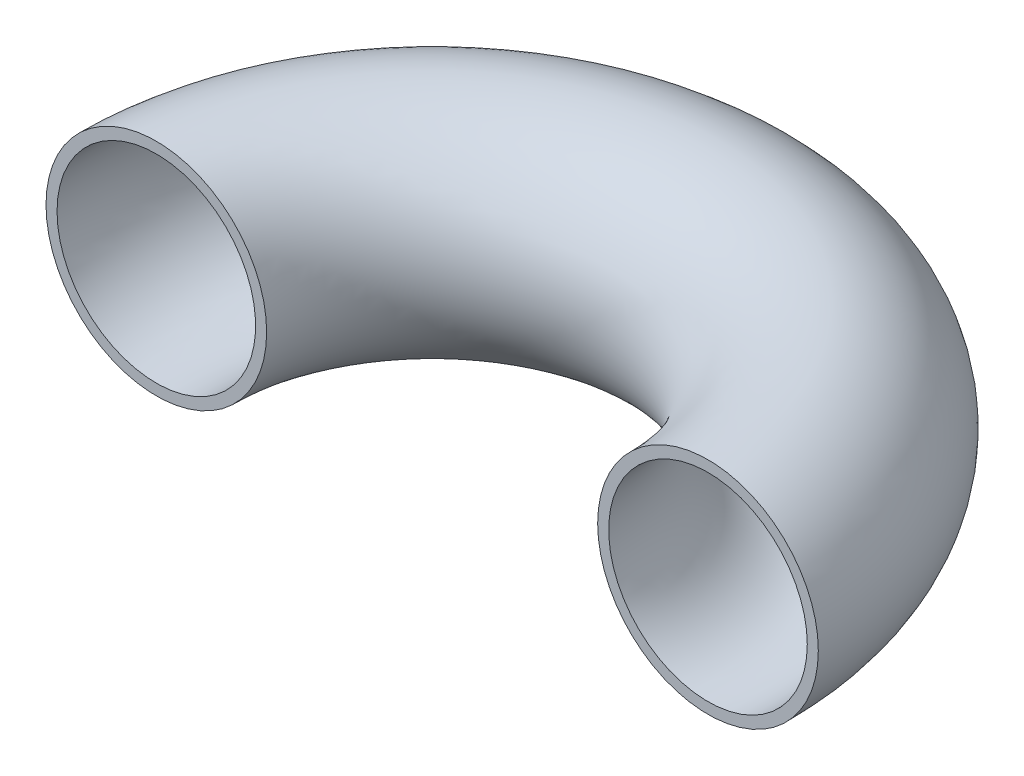
ISO-10303-21;
HEADER;
FILE_DESCRIPTION(('STEP AP214'),'2;1');
FILE_NAME('part.step','',(''),(''),'','','');
FILE_SCHEMA(('AUTOMOTIVE_DESIGN { 1 0 10303 214 1 1 1 1 }'));
ENDSEC;
DATA;
#1=APPLICATION_CONTEXT('core data for automotive mechanical design processes');
#2=APPLICATION_PROTOCOL_DEFINITION('international standard','automotive_design',2000,#1);
#3=PRODUCT_CONTEXT('',#1,'mechanical');
#4=PRODUCT('Part','Part','',(#3));
#5=PRODUCT_RELATED_PRODUCT_CATEGORY('part','',(#4));
#6=PRODUCT_DEFINITION_FORMATION('','',#4);
#7=PRODUCT_DEFINITION_CONTEXT('part definition',#1,'design');
#8=PRODUCT_DEFINITION('design','',#6,#7);
#9=PRODUCT_DEFINITION_SHAPE('','',#8);
#10=(LENGTH_UNIT() NAMED_UNIT(*) SI_UNIT(.MILLI.,.METRE.));
#11=(NAMED_UNIT(*) PLANE_ANGLE_UNIT() SI_UNIT($,.RADIAN.));
#12=(NAMED_UNIT(*) SI_UNIT($,.STERADIAN.) SOLID_ANGLE_UNIT());
#13=UNCERTAINTY_MEASURE_WITH_UNIT(LENGTH_MEASURE(1.E-05),#10,'distance_accuracy_value','');
#14=(GEOMETRIC_REPRESENTATION_CONTEXT(3) GLOBAL_UNCERTAINTY_ASSIGNED_CONTEXT((#13)) GLOBAL_UNIT_ASSIGNED_CONTEXT((#10,
#11,#12)) REPRESENTATION_CONTEXT('',''));
#15=CARTESIAN_POINT('',(0.,0.,0.));
#16=DIRECTION('',(0.,0.,1.));
#17=DIRECTION('',(1.,0.,0.));
#18=AXIS2_PLACEMENT_3D('',#15,#16,#17);
#19=CARTESIAN_POINT('',(0.,0.,0.));
#20=DIRECTION('',(0.,0.,1.));
#21=DIRECTION('',(1.,0.,0.));
#22=AXIS2_PLACEMENT_3D('',#19,#20,#21);
#23=PLANE('',#22);
#24=CARTESIAN_POINT('',(0.,0.,0.));
#25=DIRECTION('',(0.,0.,1.));
#26=DIRECTION('',(1.,0.,0.));
#27=AXIS2_PLACEMENT_3D('',#24,#25,#26);
#28=CIRCLE('',#27,4.5);
#29=CARTESIAN_POINT('',(-4.5,0.,0.));
#30=VERTEX_POINT('',#29);
#31=EDGE_CURVE('E51',#30,#30,#28,.T.);
#32=ORIENTED_EDGE('',*,*,#31,.F.);
#33=EDGE_LOOP('',(#32));
#34=FACE_BOUND('',#33,.T.);
#35=CARTESIAN_POINT('',(0.,0.,0.));
#36=DIRECTION('',(0.,0.,1.));
#37=DIRECTION('',(1.,0.,0.));
#38=AXIS2_PLACEMENT_3D('',#35,#36,#37);
#39=CIRCLE('',#38,5.);
#40=CARTESIAN_POINT('',(-5.,0.,0.));
#41=VERTEX_POINT('',#40);
#42=EDGE_CURVE('E43',#41,#41,#39,.T.);
#43=ORIENTED_EDGE('',*,*,#42,.T.);
#44=EDGE_LOOP('',(#43));
#45=FACE_BOUND('',#44,.T.);
#46=ADVANCED_FACE('F37',(#34,#45),#23,.T.);
#47=CARTESIAN_POINT('',(25.,0.,0.));
#48=DIRECTION('',(0.,0.,-1.));
#49=DIRECTION('',(-1.,0.,0.));
#50=AXIS2_PLACEMENT_3D('',#47,#48,#49);
#51=PLANE('',#50);
#52=CARTESIAN_POINT('',(25.,0.,0.));
#53=DIRECTION('',(0.,0.,-1.));
#54=DIRECTION('',(-1.,0.,0.));
#55=AXIS2_PLACEMENT_3D('',#52,#53,#54);
#56=CIRCLE('',#55,4.5);
#57=CARTESIAN_POINT('',(29.5,0.,0.));
#58=VERTEX_POINT('',#57);
#59=EDGE_CURVE('E47',#58,#58,#56,.T.);
#60=ORIENTED_EDGE('',*,*,#59,.T.);
#61=EDGE_LOOP('',(#60));
#62=FACE_BOUND('',#61,.T.);
#63=CARTESIAN_POINT('',(25.,0.,0.));
#64=DIRECTION('',(0.,0.,-1.));
#65=DIRECTION('',(-1.,0.,0.));
#66=AXIS2_PLACEMENT_3D('',#63,#64,#65);
#67=CIRCLE('',#66,5.);
#68=CARTESIAN_POINT('',(30.,0.,0.));
#69=VERTEX_POINT('',#68);
#70=EDGE_CURVE('E10',#69,#69,#67,.T.);
#71=ORIENTED_EDGE('',*,*,#70,.F.);
#72=EDGE_LOOP('',(#71));
#73=FACE_BOUND('',#72,.T.);
#74=ADVANCED_FACE('F60',(#62,#73),#51,.F.);
#75=CARTESIAN_POINT('',(12.5,0.,0.));
#76=DIRECTION('',(0.,-1.,0.));
#77=DIRECTION('',(0.,0.,-1.));
#78=AXIS2_PLACEMENT_3D('',#75,#76,#77);
#79=TOROIDAL_SURFACE('',#78,12.5,5.);
#80=CARTESIAN_POINT('',(12.5,0.,0.));
#81=DIRECTION('',(0.,-1.,0.));
#82=DIRECTION('',(0.,0.,-1.));
#83=AXIS2_PLACEMENT_3D('',#80,#81,#82);
#84=CIRCLE('',#83,17.5);
#85=EDGE_CURVE('',#41,#69,#84,.T.);
#86=ORIENTED_EDGE('',*,*,#42,.F.);
#87=ORIENTED_EDGE('',*,*,#70,.T.);
#88=ORIENTED_EDGE('',*,*,#85,.T.);
#89=ORIENTED_EDGE('',*,*,#85,.F.);
#90=EDGE_LOOP('',(#86,#88,#87,#89));
#91=FACE_BOUND('',#90,.T.);
#92=ADVANCED_FACE('F65',(#91),#79,.T.);
#93=CARTESIAN_POINT('',(12.5,0.,0.));
#94=DIRECTION('',(0.,-1.,0.));
#95=DIRECTION('',(0.,0.,-1.));
#96=AXIS2_PLACEMENT_3D('',#93,#94,#95);
#97=TOROIDAL_SURFACE('',#96,12.5,4.5);
#98=CARTESIAN_POINT('',(12.5,0.,0.));
#99=DIRECTION('',(0.,-1.,0.));
#100=DIRECTION('',(0.,0.,-1.));
#101=AXIS2_PLACEMENT_3D('',#98,#99,#100);
#102=CIRCLE('',#101,17.);
#103=EDGE_CURVE('',#30,#58,#102,.T.);
#104=ORIENTED_EDGE('',*,*,#31,.T.);
#105=ORIENTED_EDGE('',*,*,#59,.F.);
#106=ORIENTED_EDGE('',*,*,#103,.T.);
#107=ORIENTED_EDGE('',*,*,#103,.F.);
#108=EDGE_LOOP('',(#104,#106,#105,#107));
#109=FACE_BOUND('',#108,.T.);
#110=ADVANCED_FACE('F57',(#109),#97,.F.);
#111=CLOSED_SHELL('',(#46,#74,#92,#110));
#112=MANIFOLD_SOLID_BREP('B2',#111);
#113=ADVANCED_BREP_SHAPE_REPRESENTATION('',(#18,#112),#14);
#114=SHAPE_DEFINITION_REPRESENTATION(#9,#113);
ENDSEC;
END-ISO-10303-21;
